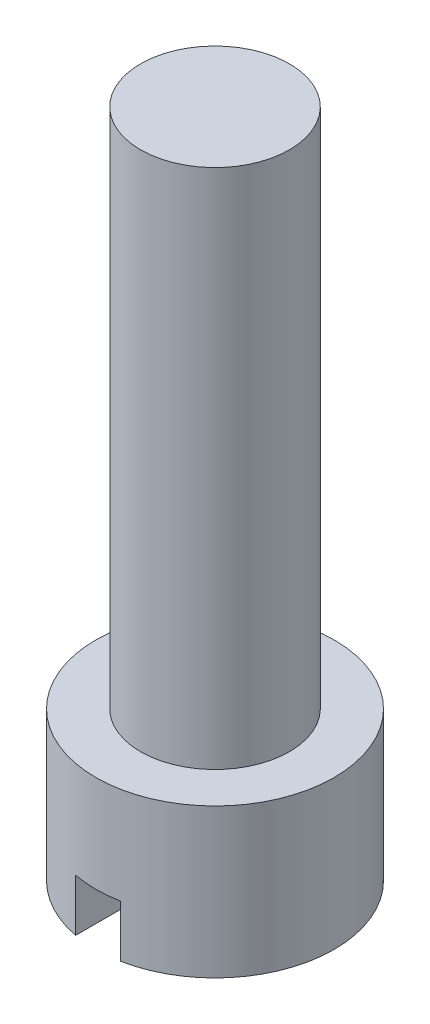
ISO-10303-21;
HEADER;
FILE_DESCRIPTION(('STEP AP214'),'2;1');
FILE_NAME('part.step','',(''),(''),'','','');
FILE_SCHEMA(('AUTOMOTIVE_DESIGN { 1 0 10303 214 1 1 1 1 }'));
ENDSEC;
DATA;
#1=APPLICATION_CONTEXT('core data for automotive mechanical design processes');
#2=APPLICATION_PROTOCOL_DEFINITION('international standard','automotive_design',2000,#1);
#3=PRODUCT_CONTEXT('',#1,'mechanical');
#4=PRODUCT('Part','Part','',(#3));
#5=PRODUCT_RELATED_PRODUCT_CATEGORY('part','',(#4));
#6=PRODUCT_DEFINITION_FORMATION('','',#4);
#7=PRODUCT_DEFINITION_CONTEXT('part definition',#1,'design');
#8=PRODUCT_DEFINITION('design','',#6,#7);
#9=PRODUCT_DEFINITION_SHAPE('','',#8);
#10=(LENGTH_UNIT() NAMED_UNIT(*) SI_UNIT(.MILLI.,.METRE.));
#11=(NAMED_UNIT(*) PLANE_ANGLE_UNIT() SI_UNIT($,.RADIAN.));
#12=(NAMED_UNIT(*) SI_UNIT($,.STERADIAN.) SOLID_ANGLE_UNIT());
#13=UNCERTAINTY_MEASURE_WITH_UNIT(LENGTH_MEASURE(1.E-05),#10,'distance_accuracy_value','');
#14=(GEOMETRIC_REPRESENTATION_CONTEXT(3) GLOBAL_UNCERTAINTY_ASSIGNED_CONTEXT((#13)) GLOBAL_UNIT_ASSIGNED_CONTEXT((#10,
#11,#12)) REPRESENTATION_CONTEXT('',''));
#15=CARTESIAN_POINT('',(0.,0.,0.));
#16=DIRECTION('',(0.,0.,1.));
#17=DIRECTION('',(1.,0.,0.));
#18=AXIS2_PLACEMENT_3D('',#15,#16,#17);
#19=CARTESIAN_POINT('',(0.,0.,0.));
#20=DIRECTION('',(0.,1.,0.));
#21=DIRECTION('',(0.,0.,0.999999999999998));
#22=AXIS2_PLACEMENT_3D('',#19,#20,#21);
#23=PLANE('',#22);
#24=CARTESIAN_POINT('',(0.,0.,0.));
#25=DIRECTION('',(0.,1.,0.));
#26=DIRECTION('',(0.,0.,0.999999999999998));
#27=AXIS2_PLACEMENT_3D('',#24,#25,#26);
#28=CIRCLE('',#27,8.);
#29=CARTESIAN_POINT('',(-1.5,0.,-7.85811682275085));
#30=VERTEX_POINT('',#29);
#31=CARTESIAN_POINT('',(-1.5,0.,7.85811682275087));
#32=VERTEX_POINT('',#31);
#33=EDGE_CURVE('E92',#30,#32,#28,.T.);
#34=ORIENTED_EDGE('',*,*,#33,.F.);
#35=DIRECTION('',(0.,0.,0.999999999999998));
#36=VECTOR('',#35,1.);
#37=CARTESIAN_POINT('',(-1.5,0.,0.));
#38=LINE('',#37,#36);
#39=EDGE_CURVE('E84',#30,#32,#38,.T.);
#40=ORIENTED_EDGE('',*,*,#39,.T.);
#41=EDGE_LOOP('',(#34,#40));
#42=FACE_BOUND('',#41,.T.);
#43=ADVANCED_FACE('F36',(#42),#23,.F.);
#44=CARTESIAN_POINT('',(0.,9.99999999999999,0.));
#45=DIRECTION('',(0.,-1.,0.));
#46=DIRECTION('',(0.,0.,-0.999999999999998));
#47=AXIS2_PLACEMENT_3D('',#44,#45,#46);
#48=CYLINDRICAL_SURFACE('',#47,8.);
#49=CARTESIAN_POINT('',(0.,9.99999999999999,0.));
#50=DIRECTION('',(0.,1.,0.));
#51=DIRECTION('',(0.,0.,0.999999999999998));
#52=AXIS2_PLACEMENT_3D('',#49,#50,#51);
#53=CIRCLE('',#52,8.);
#54=CARTESIAN_POINT('',(0.,9.99999999999999,7.99999999999997));
#55=VERTEX_POINT('',#54);
#56=EDGE_CURVE('E85',#55,#55,#53,.T.);
#57=ORIENTED_EDGE('',*,*,#56,.F.);
#58=EDGE_LOOP('',(#57));
#59=FACE_BOUND('',#58,.T.);
#60=ORIENTED_EDGE('',*,*,#33,.T.);
#61=DIRECTION('',(0.,-1.,0.));
#62=VECTOR('',#61,1.);
#63=CARTESIAN_POINT('',(-1.49999999999996,9.99999999999999,7.85811682275085));
#64=LINE('',#63,#62);
#65=CARTESIAN_POINT('',(-1.49999999999999,3.5,7.85811682275087));
#66=VERTEX_POINT('',#65);
#67=EDGE_CURVE('E59',#32,#66,#64,.F.);
#68=ORIENTED_EDGE('',*,*,#67,.T.);
#69=CARTESIAN_POINT('',(0.,3.5,0.));
#70=DIRECTION('',(0.,1.,0.));
#71=DIRECTION('',(0.,0.,0.999999999999998));
#72=AXIS2_PLACEMENT_3D('',#69,#70,#71);
#73=CIRCLE('',#72,8.);
#74=CARTESIAN_POINT('',(1.50000000000002,3.5,7.85811682275086));
#75=VERTEX_POINT('',#74);
#76=EDGE_CURVE('E11',#66,#75,#73,.T.);
#77=ORIENTED_EDGE('',*,*,#76,.T.);
#78=DIRECTION('',(0.,-1.,0.));
#79=VECTOR('',#78,1.);
#80=CARTESIAN_POINT('',(1.50000000000004,9.99999999999999,7.85811682275084));
#81=LINE('',#80,#79);
#82=CARTESIAN_POINT('',(1.5,0.,7.85811682275087));
#83=VERTEX_POINT('',#82);
#84=EDGE_CURVE('E79',#75,#83,#81,.T.);
#85=ORIENTED_EDGE('',*,*,#84,.T.);
#86=CARTESIAN_POINT('',(1.5,0.,-7.85811682275085));
#87=VERTEX_POINT('',#86);
#88=EDGE_CURVE('E89',#83,#87,#28,.T.);
#89=ORIENTED_EDGE('',*,*,#88,.T.);
#90=DIRECTION('',(0.,-1.,0.));
#91=VECTOR('',#90,1.);
#92=CARTESIAN_POINT('',(1.50000000000003,9.99999999999997,-7.85811682275085));
#93=LINE('',#92,#91);
#94=CARTESIAN_POINT('',(1.5,3.5,-7.85811682275085));
#95=VERTEX_POINT('',#94);
#96=EDGE_CURVE('E51',#87,#95,#93,.F.);
#97=ORIENTED_EDGE('',*,*,#96,.T.);
#98=CARTESIAN_POINT('',(-1.5,3.5,-7.85811682275085));
#99=VERTEX_POINT('',#98);
#100=EDGE_CURVE('E40',#95,#99,#73,.T.);
#101=ORIENTED_EDGE('',*,*,#100,.T.);
#102=DIRECTION('',(0.,-1.,0.));
#103=VECTOR('',#102,1.);
#104=CARTESIAN_POINT('',(-1.49999999999997,9.99999999999997,-7.85811682275085));
#105=LINE('',#104,#103);
#106=EDGE_CURVE('E96',#99,#30,#105,.T.);
#107=ORIENTED_EDGE('',*,*,#106,.T.);
#108=EDGE_LOOP('',(#60,#68,#77,#85,#89,#97,#101,#107));
#109=FACE_BOUND('',#108,.T.);
#110=ADVANCED_FACE('F38',(#59,#109),#48,.T.);
#111=CARTESIAN_POINT('',(0.,9.99999999999999,0.));
#112=DIRECTION('',(0.,1.,0.));
#113=DIRECTION('',(0.,0.,0.999999999999998));
#114=AXIS2_PLACEMENT_3D('',#111,#112,#113);
#115=PLANE('',#114);
#116=CARTESIAN_POINT('',(0.,9.99999999999999,0.));
#117=DIRECTION('',(0.,1.,0.));
#118=DIRECTION('',(0.,0.,0.999999999999998));
#119=AXIS2_PLACEMENT_3D('',#116,#117,#118);
#120=CIRCLE('',#119,5.);
#121=CARTESIAN_POINT('',(0.,9.99999999999999,4.99999999999998));
#122=VERTEX_POINT('',#121);
#123=EDGE_CURVE('E111',#122,#122,#120,.T.);
#124=ORIENTED_EDGE('',*,*,#123,.F.);
#125=EDGE_LOOP('',(#124));
#126=FACE_BOUND('',#125,.T.);
#127=ORIENTED_EDGE('',*,*,#56,.T.);
#128=EDGE_LOOP('',(#127));
#129=FACE_BOUND('',#128,.T.);
#130=ADVANCED_FACE('F120',(#126,#129),#115,.T.);
#131=ORIENTED_EDGE('',*,*,#88,.F.);
#132=DIRECTION('',(0.,0.,-0.999999999999998));
#133=VECTOR('',#132,1.);
#134=CARTESIAN_POINT('',(1.5,0.,0.));
#135=LINE('',#134,#133);
#136=EDGE_CURVE('E76',#83,#87,#135,.T.);
#137=ORIENTED_EDGE('',*,*,#136,.T.);
#138=EDGE_LOOP('',(#131,#137));
#139=FACE_BOUND('',#138,.T.);
#140=ADVANCED_FACE('F91',(#139),#23,.F.);
#141=CARTESIAN_POINT('',(-1.5,3.5,-11.95));
#142=DIRECTION('',(0.,1.,0.));
#143=DIRECTION('',(0.,0.,0.999999999999998));
#144=AXIS2_PLACEMENT_3D('',#141,#142,#143);
#145=PLANE('',#144);
#146=DIRECTION('',(0.,0.,0.999999999999998));
#147=VECTOR('',#146,1.);
#148=CARTESIAN_POINT('',(1.5,3.5,-11.95));
#149=LINE('',#148,#147);
#150=EDGE_CURVE('E105',#95,#75,#149,.T.);
#151=ORIENTED_EDGE('',*,*,#150,.T.);
#152=ORIENTED_EDGE('',*,*,#76,.F.);
#153=DIRECTION('',(0.,0.,0.999999999999998));
#154=VECTOR('',#153,1.);
#155=CARTESIAN_POINT('',(-1.5,3.5,-11.95));
#156=LINE('',#155,#154);
#157=EDGE_CURVE('E106',#99,#66,#156,.T.);
#158=ORIENTED_EDGE('',*,*,#157,.F.);
#159=ORIENTED_EDGE('',*,*,#100,.F.);
#160=EDGE_LOOP('',(#151,#152,#158,#159));
#161=FACE_BOUND('',#160,.T.);
#162=ADVANCED_FACE('F104',(#161),#145,.F.);
#163=CARTESIAN_POINT('',(-1.5,3.5,-11.95));
#164=DIRECTION('',(-1.,0.,0.));
#165=DIRECTION('',(0.,-1.,0.));
#166=AXIS2_PLACEMENT_3D('',#163,#164,#165);
#167=PLANE('',#166);
#168=ORIENTED_EDGE('',*,*,#157,.T.);
#169=ORIENTED_EDGE('',*,*,#67,.F.);
#170=ORIENTED_EDGE('',*,*,#39,.F.);
#171=ORIENTED_EDGE('',*,*,#106,.F.);
#172=EDGE_LOOP('',(#168,#169,#170,#171));
#173=FACE_BOUND('',#172,.T.);
#174=ADVANCED_FACE('F128',(#173),#167,.F.);
#175=CARTESIAN_POINT('',(1.5,3.5,-11.95));
#176=DIRECTION('',(1.,0.,0.));
#177=DIRECTION('',(0.,1.,0.));
#178=AXIS2_PLACEMENT_3D('',#175,#176,#177);
#179=PLANE('',#178);
#180=ORIENTED_EDGE('',*,*,#150,.F.);
#181=ORIENTED_EDGE('',*,*,#96,.F.);
#182=ORIENTED_EDGE('',*,*,#136,.F.);
#183=ORIENTED_EDGE('',*,*,#84,.F.);
#184=EDGE_LOOP('',(#180,#181,#182,#183));
#185=FACE_BOUND('',#184,.T.);
#186=ADVANCED_FACE('F78',(#185),#179,.F.);
#187=CARTESIAN_POINT('',(0.,45.,0.));
#188=DIRECTION('',(0.,-1.,0.));
#189=DIRECTION('',(0.,0.,-0.999999999999998));
#190=AXIS2_PLACEMENT_3D('',#187,#188,#189);
#191=CYLINDRICAL_SURFACE('',#190,5.);
#192=CARTESIAN_POINT('',(0.,45.,0.));
#193=DIRECTION('',(0.,1.,0.));
#194=DIRECTION('',(0.,0.,0.999999999999998));
#195=AXIS2_PLACEMENT_3D('',#192,#193,#194);
#196=CIRCLE('',#195,5.);
#197=CARTESIAN_POINT('',(0.,45.,4.99999999999998));
#198=VERTEX_POINT('',#197);
#199=EDGE_CURVE('E107',#198,#198,#196,.T.);
#200=ORIENTED_EDGE('',*,*,#199,.F.);
#201=EDGE_LOOP('',(#200));
#202=FACE_BOUND('',#201,.T.);
#203=ORIENTED_EDGE('',*,*,#123,.T.);
#204=EDGE_LOOP('',(#203));
#205=FACE_BOUND('',#204,.T.);
#206=ADVANCED_FACE('F139',(#202,#205),#191,.T.);
#207=CARTESIAN_POINT('',(0.,45.,0.));
#208=DIRECTION('',(0.,1.,0.));
#209=DIRECTION('',(0.,0.,0.999999999999998));
#210=AXIS2_PLACEMENT_3D('',#207,#208,#209);
#211=PLANE('',#210);
#212=ORIENTED_EDGE('',*,*,#199,.T.);
#213=EDGE_LOOP('',(#212));
#214=FACE_BOUND('',#213,.T.);
#215=ADVANCED_FACE('F143',(#214),#211,.T.);
#216=CLOSED_SHELL('',(#43,#110,#130,#140,#162,#174,#186,#206,#215));
#217=MANIFOLD_SOLID_BREP('B2',#216);
#218=ADVANCED_BREP_SHAPE_REPRESENTATION('',(#18,#217),#14);
#219=SHAPE_DEFINITION_REPRESENTATION(#9,#218);
ENDSEC;
END-ISO-10303-21;
